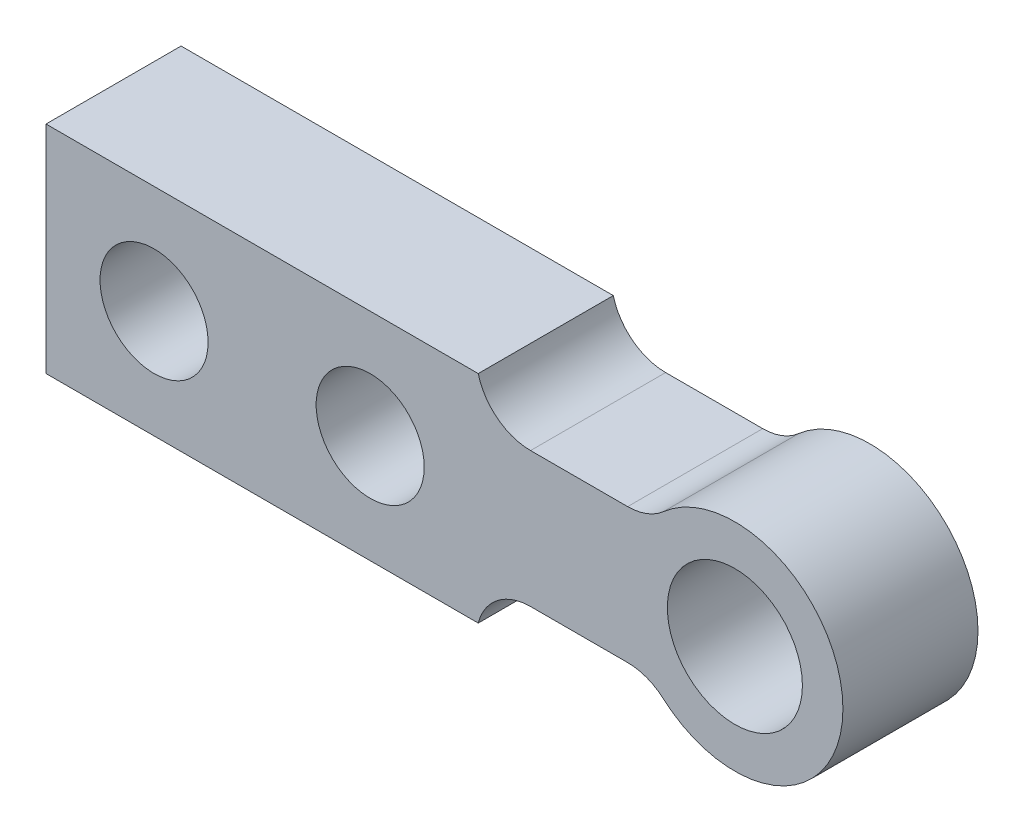
ISO-10303-21;
HEADER;
FILE_DESCRIPTION(('STEP AP214'),'2;1');
FILE_NAME('part.step','',(''),(''),'','','');
FILE_SCHEMA(('AUTOMOTIVE_DESIGN { 1 0 10303 214 1 1 1 1 }'));
ENDSEC;
DATA;
#1=APPLICATION_CONTEXT('core data for automotive mechanical design processes');
#2=APPLICATION_PROTOCOL_DEFINITION('international standard','automotive_design',2000,#1);
#3=PRODUCT_CONTEXT('',#1,'mechanical');
#4=PRODUCT('Part','Part','',(#3));
#5=PRODUCT_RELATED_PRODUCT_CATEGORY('part','',(#4));
#6=PRODUCT_DEFINITION_FORMATION('','',#4);
#7=PRODUCT_DEFINITION_CONTEXT('part definition',#1,'design');
#8=PRODUCT_DEFINITION('design','',#6,#7);
#9=PRODUCT_DEFINITION_SHAPE('','',#8);
#10=(LENGTH_UNIT() NAMED_UNIT(*) SI_UNIT(.MILLI.,.METRE.));
#11=(NAMED_UNIT(*) PLANE_ANGLE_UNIT() SI_UNIT($,.RADIAN.));
#12=(NAMED_UNIT(*) SI_UNIT($,.STERADIAN.) SOLID_ANGLE_UNIT());
#13=UNCERTAINTY_MEASURE_WITH_UNIT(LENGTH_MEASURE(1.E-05),#10,'distance_accuracy_value','');
#14=(GEOMETRIC_REPRESENTATION_CONTEXT(3) GLOBAL_UNCERTAINTY_ASSIGNED_CONTEXT((#13)) GLOBAL_UNIT_ASSIGNED_CONTEXT((#10,
#11,#12)) REPRESENTATION_CONTEXT('',''));
#15=CARTESIAN_POINT('',(0.,0.,0.));
#16=DIRECTION('',(0.,0.,1.));
#17=DIRECTION('',(1.,0.,0.));
#18=AXIS2_PLACEMENT_3D('',#15,#16,#17);
#19=CARTESIAN_POINT('',(0.,-2.5,5.));
#20=DIRECTION('',(0.,1.,0.));
#21=DIRECTION('',(0.,0.,1.));
#22=AXIS2_PLACEMENT_3D('',#19,#20,#21);
#23=PLANE('',#22);
#24=DIRECTION('',(1.,0.,0.));
#25=VECTOR('',#24,1.);
#26=CARTESIAN_POINT('',(0.,-2.5,0.));
#27=LINE('',#26,#25);
#28=CARTESIAN_POINT('',(9.93649167310371,-2.5,0.));
#29=VERTEX_POINT('',#28);
#30=CARTESIAN_POINT('',(13.5313730334031,-2.5,0.));
#31=VERTEX_POINT('',#30);
#32=EDGE_CURVE('E175',#29,#31,#27,.T.);
#33=ORIENTED_EDGE('',*,*,#32,.T.);
#34=DIRECTION('',(0.,0.,1.));
#35=VECTOR('',#34,1.);
#36=CARTESIAN_POINT('',(13.5313730334031,-2.5,5.));
#37=LINE('',#36,#35);
#38=CARTESIAN_POINT('',(13.5313730334031,-2.5,5.));
#39=VERTEX_POINT('',#38);
#40=EDGE_CURVE('E144',#31,#39,#37,.T.);
#41=ORIENTED_EDGE('',*,*,#40,.T.);
#42=DIRECTION('',(1.,0.,0.));
#43=VECTOR('',#42,1.);
#44=CARTESIAN_POINT('',(0.,-2.5,5.));
#45=LINE('',#44,#43);
#46=CARTESIAN_POINT('',(9.93649167310371,-2.5,5.));
#47=VERTEX_POINT('',#46);
#48=EDGE_CURVE('E192',#47,#39,#45,.T.);
#49=ORIENTED_EDGE('',*,*,#48,.F.);
#50=DIRECTION('',(0.,0.,1.));
#51=VECTOR('',#50,1.);
#52=CARTESIAN_POINT('',(9.93649167310371,-2.5,5.));
#53=LINE('',#52,#51);
#54=EDGE_CURVE('E141',#47,#29,#53,.F.);
#55=ORIENTED_EDGE('',*,*,#54,.T.);
#56=EDGE_LOOP('',(#33,#41,#49,#55));
#57=FACE_BOUND('',#56,.T.);
#58=ADVANCED_FACE('F37',(#57),#23,.F.);
#59=CARTESIAN_POINT('',(17.5,0.,5.));
#60=DIRECTION('',(0.,0.,-1.));
#61=DIRECTION('',(-1.,0.,0.));
#62=AXIS2_PLACEMENT_3D('',#59,#60,#61);
#63=CYLINDRICAL_SURFACE('',#62,4.);
#64=CARTESIAN_POINT('',(17.5,0.,5.));
#65=DIRECTION('',(0.,0.,1.));
#66=DIRECTION('',(1.,0.,0.));
#67=AXIS2_PLACEMENT_3D('',#64,#65,#66);
#68=CIRCLE('',#67,4.);
#69=CARTESIAN_POINT('',(14.8542486889354,-3.,5.));
#70=VERTEX_POINT('',#69);
#71=CARTESIAN_POINT('',(14.8542486889354,3.,5.));
#72=VERTEX_POINT('',#71);
#73=EDGE_CURVE('E215',#70,#72,#68,.T.);
#74=ORIENTED_EDGE('',*,*,#73,.F.);
#75=DIRECTION('',(0.,0.,-1.));
#76=VECTOR('',#75,1.);
#77=CARTESIAN_POINT('',(14.8542486889354,-3.,5.));
#78=LINE('',#77,#76);
#79=CARTESIAN_POINT('',(14.8542486889354,-3.,0.));
#80=VERTEX_POINT('',#79);
#81=EDGE_CURVE('E133',#70,#80,#78,.T.);
#82=ORIENTED_EDGE('',*,*,#81,.T.);
#83=CARTESIAN_POINT('',(17.5,0.,0.));
#84=DIRECTION('',(0.,0.,1.));
#85=DIRECTION('',(1.,0.,0.));
#86=AXIS2_PLACEMENT_3D('',#83,#84,#85);
#87=CIRCLE('',#86,4.);
#88=CARTESIAN_POINT('',(14.8542486889354,3.,0.));
#89=VERTEX_POINT('',#88);
#90=EDGE_CURVE('E170',#80,#89,#87,.T.);
#91=ORIENTED_EDGE('',*,*,#90,.T.);
#92=DIRECTION('',(0.,0.,-1.));
#93=VECTOR('',#92,1.);
#94=CARTESIAN_POINT('',(14.8542486889354,3.,5.));
#95=LINE('',#94,#93);
#96=EDGE_CURVE('E131',#89,#72,#95,.F.);
#97=ORIENTED_EDGE('',*,*,#96,.T.);
#98=EDGE_LOOP('',(#74,#82,#91,#97));
#99=FACE_BOUND('',#98,.T.);
#100=ADVANCED_FACE('F245',(#99),#63,.T.);
#101=CARTESIAN_POINT('',(0.,2.5,5.));
#102=DIRECTION('',(0.,1.,0.));
#103=DIRECTION('',(0.,0.,1.));
#104=AXIS2_PLACEMENT_3D('',#101,#102,#103);
#105=PLANE('',#104);
#106=DIRECTION('',(1.,0.,0.));
#107=VECTOR('',#106,1.);
#108=CARTESIAN_POINT('',(0.,2.5,5.));
#109=LINE('',#108,#107);
#110=CARTESIAN_POINT('',(9.93649167310371,2.5,5.));
#111=VERTEX_POINT('',#110);
#112=CARTESIAN_POINT('',(13.5313730334031,2.5,5.));
#113=VERTEX_POINT('',#112);
#114=EDGE_CURVE('E118',#111,#113,#109,.T.);
#115=ORIENTED_EDGE('',*,*,#114,.T.);
#116=DIRECTION('',(0.,0.,-1.));
#117=VECTOR('',#116,1.);
#118=CARTESIAN_POINT('',(13.5313730334031,2.5,5.));
#119=LINE('',#118,#117);
#120=CARTESIAN_POINT('',(13.5313730334031,2.5,0.));
#121=VERTEX_POINT('',#120);
#122=EDGE_CURVE('E147',#113,#121,#119,.T.);
#123=ORIENTED_EDGE('',*,*,#122,.T.);
#124=DIRECTION('',(1.,0.,0.));
#125=VECTOR('',#124,1.);
#126=CARTESIAN_POINT('',(0.,2.5,0.));
#127=LINE('',#126,#125);
#128=CARTESIAN_POINT('',(9.93649167310371,2.5,0.));
#129=VERTEX_POINT('',#128);
#130=EDGE_CURVE('E165',#129,#121,#127,.T.);
#131=ORIENTED_EDGE('',*,*,#130,.F.);
#132=DIRECTION('',(0.,0.,-1.));
#133=VECTOR('',#132,1.);
#134=CARTESIAN_POINT('',(9.93649167310371,2.5,5.));
#135=LINE('',#134,#133);
#136=EDGE_CURVE('E59',#129,#111,#135,.F.);
#137=ORIENTED_EDGE('',*,*,#136,.T.);
#138=EDGE_LOOP('',(#115,#123,#131,#137));
#139=FACE_BOUND('',#138,.T.);
#140=ADVANCED_FACE('F168',(#139),#105,.T.);
#141=CARTESIAN_POINT('',(0.,4.,5.));
#142=DIRECTION('',(0.,1.,0.));
#143=DIRECTION('',(0.,0.,1.));
#144=AXIS2_PLACEMENT_3D('',#141,#142,#143);
#145=PLANE('',#144);
#146=DIRECTION('',(1.,0.,0.));
#147=VECTOR('',#146,1.);
#148=CARTESIAN_POINT('',(0.,4.,0.));
#149=LINE('',#148,#147);
#150=CARTESIAN_POINT('',(-8.,4.,0.));
#151=VERTEX_POINT('',#150);
#152=CARTESIAN_POINT('',(8.,4.,0.));
#153=VERTEX_POINT('',#152);
#154=EDGE_CURVE('E167',#151,#153,#149,.T.);
#155=ORIENTED_EDGE('',*,*,#154,.F.);
#156=DIRECTION('',(0.,0.,-1.));
#157=VECTOR('',#156,1.);
#158=CARTESIAN_POINT('',(-8.,4.,5.));
#159=LINE('',#158,#157);
#160=CARTESIAN_POINT('',(-8.,4.,5.));
#161=VERTEX_POINT('',#160);
#162=EDGE_CURVE('E127',#161,#151,#159,.T.);
#163=ORIENTED_EDGE('',*,*,#162,.F.);
#164=DIRECTION('',(1.,0.,0.));
#165=VECTOR('',#164,1.);
#166=CARTESIAN_POINT('',(0.,4.,5.));
#167=LINE('',#166,#165);
#168=CARTESIAN_POINT('',(8.,4.,5.));
#169=VERTEX_POINT('',#168);
#170=EDGE_CURVE('E117',#161,#169,#167,.T.);
#171=ORIENTED_EDGE('',*,*,#170,.T.);
#172=DIRECTION('',(0.,0.,-1.));
#173=VECTOR('',#172,1.);
#174=CARTESIAN_POINT('',(8.,4.,5.));
#175=LINE('',#174,#173);
#176=EDGE_CURVE('E125',#169,#153,#175,.T.);
#177=ORIENTED_EDGE('',*,*,#176,.T.);
#178=EDGE_LOOP('',(#155,#163,#171,#177));
#179=FACE_BOUND('',#178,.T.);
#180=ADVANCED_FACE('F124',(#179),#145,.T.);
#181=CARTESIAN_POINT('',(-8.,0.,5.));
#182=DIRECTION('',(1.,0.,0.));
#183=DIRECTION('',(0.,1.,0.));
#184=AXIS2_PLACEMENT_3D('',#181,#182,#183);
#185=PLANE('',#184);
#186=DIRECTION('',(0.,-1.,0.));
#187=VECTOR('',#186,1.);
#188=CARTESIAN_POINT('',(-8.,0.,0.));
#189=LINE('',#188,#187);
#190=CARTESIAN_POINT('',(-8.,-4.,0.));
#191=VERTEX_POINT('',#190);
#192=EDGE_CURVE('E172',#151,#191,#189,.T.);
#193=ORIENTED_EDGE('',*,*,#192,.T.);
#194=DIRECTION('',(0.,0.,-1.));
#195=VECTOR('',#194,1.);
#196=CARTESIAN_POINT('',(-8.,-4.,5.));
#197=LINE('',#196,#195);
#198=CARTESIAN_POINT('',(-8.,-4.,5.));
#199=VERTEX_POINT('',#198);
#200=EDGE_CURVE('E135',#199,#191,#197,.T.);
#201=ORIENTED_EDGE('',*,*,#200,.F.);
#202=DIRECTION('',(0.,-1.,0.));
#203=VECTOR('',#202,1.);
#204=CARTESIAN_POINT('',(-8.,0.,5.));
#205=LINE('',#204,#203);
#206=EDGE_CURVE('E129',#161,#199,#205,.T.);
#207=ORIENTED_EDGE('',*,*,#206,.F.);
#208=ORIENTED_EDGE('',*,*,#162,.T.);
#209=EDGE_LOOP('',(#193,#201,#207,#208));
#210=FACE_BOUND('',#209,.T.);
#211=ADVANCED_FACE('F309',(#210),#185,.F.);
#212=CARTESIAN_POINT('',(0.,-4.,5.));
#213=DIRECTION('',(0.,1.,0.));
#214=DIRECTION('',(0.,0.,1.));
#215=AXIS2_PLACEMENT_3D('',#212,#213,#214);
#216=PLANE('',#215);
#217=DIRECTION('',(1.,0.,0.));
#218=VECTOR('',#217,1.);
#219=CARTESIAN_POINT('',(0.,-4.,0.));
#220=LINE('',#219,#218);
#221=CARTESIAN_POINT('',(8.,-4.,0.));
#222=VERTEX_POINT('',#221);
#223=EDGE_CURVE('E180',#191,#222,#220,.T.);
#224=ORIENTED_EDGE('',*,*,#223,.T.);
#225=DIRECTION('',(0.,0.,-1.));
#226=VECTOR('',#225,1.);
#227=CARTESIAN_POINT('',(8.,-4.,5.));
#228=LINE('',#227,#226);
#229=CARTESIAN_POINT('',(8.,-4.,5.));
#230=VERTEX_POINT('',#229);
#231=EDGE_CURVE('E193',#230,#222,#228,.T.);
#232=ORIENTED_EDGE('',*,*,#231,.F.);
#233=DIRECTION('',(1.,0.,0.));
#234=VECTOR('',#233,1.);
#235=CARTESIAN_POINT('',(0.,-4.,5.));
#236=LINE('',#235,#234);
#237=EDGE_CURVE('E203',#199,#230,#236,.T.);
#238=ORIENTED_EDGE('',*,*,#237,.F.);
#239=ORIENTED_EDGE('',*,*,#200,.T.);
#240=EDGE_LOOP('',(#224,#232,#238,#239));
#241=FACE_BOUND('',#240,.T.);
#242=ADVANCED_FACE('F201',(#241),#216,.F.);
#243=CARTESIAN_POINT('',(-4.,0.,5.));
#244=DIRECTION('',(0.,0.,-1.));
#245=DIRECTION('',(-1.,0.,0.));
#246=AXIS2_PLACEMENT_3D('',#243,#244,#245);
#247=CYLINDRICAL_SURFACE('',#246,2.);
#248=CARTESIAN_POINT('',(-4.,0.,5.));
#249=DIRECTION('',(0.,0.,1.));
#250=DIRECTION('',(1.,0.,0.));
#251=AXIS2_PLACEMENT_3D('',#248,#249,#250);
#252=CIRCLE('',#251,2.);
#253=CARTESIAN_POINT('',(-2.,0.,5.));
#254=VERTEX_POINT('',#253);
#255=EDGE_CURVE('E225',#254,#254,#252,.T.);
#256=ORIENTED_EDGE('',*,*,#255,.T.);
#257=EDGE_LOOP('',(#256));
#258=FACE_BOUND('',#257,.T.);
#259=CARTESIAN_POINT('',(-4.,0.,0.));
#260=DIRECTION('',(0.,0.,1.));
#261=DIRECTION('',(1.,0.,0.));
#262=AXIS2_PLACEMENT_3D('',#259,#260,#261);
#263=CIRCLE('',#262,2.);
#264=CARTESIAN_POINT('',(-2.,0.,0.));
#265=VERTEX_POINT('',#264);
#266=EDGE_CURVE('E186',#265,#265,#263,.T.);
#267=ORIENTED_EDGE('',*,*,#266,.F.);
#268=EDGE_LOOP('',(#267));
#269=FACE_BOUND('',#268,.T.);
#270=ADVANCED_FACE('F308',(#258,#269),#247,.F.);
#271=CARTESIAN_POINT('',(4.,0.,5.));
#272=DIRECTION('',(0.,0.,-1.));
#273=DIRECTION('',(-1.,0.,0.));
#274=AXIS2_PLACEMENT_3D('',#271,#272,#273);
#275=CYLINDRICAL_SURFACE('',#274,2.);
#276=CARTESIAN_POINT('',(4.,0.,5.));
#277=DIRECTION('',(0.,0.,1.));
#278=DIRECTION('',(1.,0.,0.));
#279=AXIS2_PLACEMENT_3D('',#276,#277,#278);
#280=CIRCLE('',#279,2.);
#281=CARTESIAN_POINT('',(6.,0.,5.));
#282=VERTEX_POINT('',#281);
#283=EDGE_CURVE('E222',#282,#282,#280,.T.);
#284=ORIENTED_EDGE('',*,*,#283,.T.);
#285=EDGE_LOOP('',(#284));
#286=FACE_BOUND('',#285,.T.);
#287=CARTESIAN_POINT('',(4.,0.,0.));
#288=DIRECTION('',(0.,0.,1.));
#289=DIRECTION('',(1.,0.,0.));
#290=AXIS2_PLACEMENT_3D('',#287,#288,#289);
#291=CIRCLE('',#290,2.);
#292=CARTESIAN_POINT('',(6.,0.,0.));
#293=VERTEX_POINT('',#292);
#294=EDGE_CURVE('E183',#293,#293,#291,.T.);
#295=ORIENTED_EDGE('',*,*,#294,.F.);
#296=EDGE_LOOP('',(#295));
#297=FACE_BOUND('',#296,.T.);
#298=ADVANCED_FACE('F242',(#286,#297),#275,.F.);
#299=CARTESIAN_POINT('',(17.5,0.,5.));
#300=DIRECTION('',(0.,0.,-1.));
#301=DIRECTION('',(-1.,0.,0.));
#302=AXIS2_PLACEMENT_3D('',#299,#300,#301);
#303=CYLINDRICAL_SURFACE('',#302,2.5);
#304=CARTESIAN_POINT('',(17.5,0.,5.));
#305=DIRECTION('',(0.,0.,1.));
#306=DIRECTION('',(1.,0.,0.));
#307=AXIS2_PLACEMENT_3D('',#304,#305,#306);
#308=CIRCLE('',#307,2.5);
#309=CARTESIAN_POINT('',(20.,0.,5.));
#310=VERTEX_POINT('',#309);
#311=EDGE_CURVE('E195',#310,#310,#308,.T.);
#312=ORIENTED_EDGE('',*,*,#311,.T.);
#313=EDGE_LOOP('',(#312));
#314=FACE_BOUND('',#313,.T.);
#315=CARTESIAN_POINT('',(17.5,0.,0.));
#316=DIRECTION('',(0.,0.,1.));
#317=DIRECTION('',(1.,0.,0.));
#318=AXIS2_PLACEMENT_3D('',#315,#316,#317);
#319=CIRCLE('',#318,2.5);
#320=CARTESIAN_POINT('',(20.,0.,0.));
#321=VERTEX_POINT('',#320);
#322=EDGE_CURVE('E189',#321,#321,#319,.T.);
#323=ORIENTED_EDGE('',*,*,#322,.F.);
#324=EDGE_LOOP('',(#323));
#325=FACE_BOUND('',#324,.T.);
#326=ADVANCED_FACE('F231',(#314,#325),#303,.F.);
#327=CARTESIAN_POINT('',(0.,0.,5.));
#328=DIRECTION('',(0.,0.,1.));
#329=DIRECTION('',(1.,0.,0.));
#330=AXIS2_PLACEMENT_3D('',#327,#328,#329);
#331=PLANE('',#330);
#332=ORIENTED_EDGE('',*,*,#237,.T.);
#333=CARTESIAN_POINT('',(9.93649167310371,-4.5,5.));
#334=DIRECTION('',(0.,0.,1.));
#335=DIRECTION('',(1.,0.,0.));
#336=AXIS2_PLACEMENT_3D('',#333,#334,#335);
#337=CIRCLE('',#336,2.);
#338=EDGE_CURVE('E156',#230,#47,#337,.F.);
#339=ORIENTED_EDGE('',*,*,#338,.T.);
#340=ORIENTED_EDGE('',*,*,#48,.T.);
#341=CARTESIAN_POINT('',(13.5313730334031,-4.5,5.));
#342=DIRECTION('',(0.,0.,1.));
#343=DIRECTION('',(1.,0.,0.));
#344=AXIS2_PLACEMENT_3D('',#341,#342,#343);
#345=CIRCLE('',#344,2.);
#346=EDGE_CURVE('E152',#39,#70,#345,.F.);
#347=ORIENTED_EDGE('',*,*,#346,.T.);
#348=ORIENTED_EDGE('',*,*,#73,.T.);
#349=CARTESIAN_POINT('',(13.5313730334031,4.5,5.));
#350=DIRECTION('',(0.,0.,1.));
#351=DIRECTION('',(1.,0.,0.));
#352=AXIS2_PLACEMENT_3D('',#349,#350,#351);
#353=CIRCLE('',#352,2.);
#354=EDGE_CURVE('E52',#72,#113,#353,.F.);
#355=ORIENTED_EDGE('',*,*,#354,.T.);
#356=ORIENTED_EDGE('',*,*,#114,.F.);
#357=CARTESIAN_POINT('',(9.93649167310371,4.5,5.));
#358=DIRECTION('',(0.,0.,1.));
#359=DIRECTION('',(1.,0.,0.));
#360=AXIS2_PLACEMENT_3D('',#357,#358,#359);
#361=CIRCLE('',#360,2.);
#362=EDGE_CURVE('E11',#111,#169,#361,.F.);
#363=ORIENTED_EDGE('',*,*,#362,.T.);
#364=ORIENTED_EDGE('',*,*,#170,.F.);
#365=ORIENTED_EDGE('',*,*,#206,.T.);
#366=EDGE_LOOP('',(#332,#339,#340,#347,#348,#355,#356,#363,#364,#365));
#367=FACE_BOUND('',#366,.T.);
#368=ORIENTED_EDGE('',*,*,#283,.F.);
#369=EDGE_LOOP('',(#368));
#370=FACE_BOUND('',#369,.T.);
#371=ORIENTED_EDGE('',*,*,#255,.F.);
#372=EDGE_LOOP('',(#371));
#373=FACE_BOUND('',#372,.T.);
#374=ORIENTED_EDGE('',*,*,#311,.F.);
#375=EDGE_LOOP('',(#374));
#376=FACE_BOUND('',#375,.T.);
#377=ADVANCED_FACE('F115',(#367,#370,#373,#376),#331,.T.);
#378=CARTESIAN_POINT('',(0.,0.,0.));
#379=DIRECTION('',(0.,0.,1.));
#380=DIRECTION('',(1.,0.,0.));
#381=AXIS2_PLACEMENT_3D('',#378,#379,#380);
#382=PLANE('',#381);
#383=ORIENTED_EDGE('',*,*,#32,.F.);
#384=CARTESIAN_POINT('',(9.93649167310371,-4.5,0.));
#385=DIRECTION('',(0.,0.,1.));
#386=DIRECTION('',(1.,0.,0.));
#387=AXIS2_PLACEMENT_3D('',#384,#385,#386);
#388=CIRCLE('',#387,2.);
#389=EDGE_CURVE('E154',#29,#222,#388,.T.);
#390=ORIENTED_EDGE('',*,*,#389,.T.);
#391=ORIENTED_EDGE('',*,*,#223,.F.);
#392=ORIENTED_EDGE('',*,*,#192,.F.);
#393=ORIENTED_EDGE('',*,*,#154,.T.);
#394=CARTESIAN_POINT('',(9.93649167310371,4.5,0.));
#395=DIRECTION('',(0.,0.,1.));
#396=DIRECTION('',(1.,0.,0.));
#397=AXIS2_PLACEMENT_3D('',#394,#395,#396);
#398=CIRCLE('',#397,2.);
#399=EDGE_CURVE('E45',#153,#129,#398,.T.);
#400=ORIENTED_EDGE('',*,*,#399,.T.);
#401=ORIENTED_EDGE('',*,*,#130,.T.);
#402=CARTESIAN_POINT('',(13.5313730334031,4.5,0.));
#403=DIRECTION('',(0.,0.,1.));
#404=DIRECTION('',(1.,0.,0.));
#405=AXIS2_PLACEMENT_3D('',#402,#403,#404);
#406=CIRCLE('',#405,2.);
#407=EDGE_CURVE('E158',#121,#89,#406,.T.);
#408=ORIENTED_EDGE('',*,*,#407,.T.);
#409=ORIENTED_EDGE('',*,*,#90,.F.);
#410=CARTESIAN_POINT('',(13.5313730334031,-4.5,0.));
#411=DIRECTION('',(0.,0.,1.));
#412=DIRECTION('',(1.,0.,0.));
#413=AXIS2_PLACEMENT_3D('',#410,#411,#412);
#414=CIRCLE('',#413,2.);
#415=EDGE_CURVE('E150',#80,#31,#414,.T.);
#416=ORIENTED_EDGE('',*,*,#415,.T.);
#417=EDGE_LOOP('',(#383,#390,#391,#392,#393,#400,#401,#408,#409,#416));
#418=FACE_BOUND('',#417,.T.);
#419=ORIENTED_EDGE('',*,*,#294,.T.);
#420=EDGE_LOOP('',(#419));
#421=FACE_BOUND('',#420,.T.);
#422=ORIENTED_EDGE('',*,*,#266,.T.);
#423=EDGE_LOOP('',(#422));
#424=FACE_BOUND('',#423,.T.);
#425=ORIENTED_EDGE('',*,*,#322,.T.);
#426=EDGE_LOOP('',(#425));
#427=FACE_BOUND('',#426,.T.);
#428=ADVANCED_FACE('F163',(#418,#421,#424,#427),#382,.F.);
#429=CARTESIAN_POINT('',(13.5313730334031,-4.5,5.));
#430=DIRECTION('',(0.,0.,-1.));
#431=DIRECTION('',(-1.,0.,0.));
#432=AXIS2_PLACEMENT_3D('',#429,#430,#431);
#433=CYLINDRICAL_SURFACE('',#432,2.);
#434=ORIENTED_EDGE('',*,*,#346,.F.);
#435=ORIENTED_EDGE('',*,*,#40,.F.);
#436=ORIENTED_EDGE('',*,*,#415,.F.);
#437=ORIENTED_EDGE('',*,*,#81,.F.);
#438=EDGE_LOOP('',(#434,#435,#436,#437));
#439=FACE_BOUND('',#438,.T.);
#440=ADVANCED_FACE('F240',(#439),#433,.F.);
#441=CARTESIAN_POINT('',(9.93649167310371,-4.5,5.));
#442=DIRECTION('',(0.,0.,1.));
#443=DIRECTION('',(1.,0.,0.));
#444=AXIS2_PLACEMENT_3D('',#441,#442,#443);
#445=CYLINDRICAL_SURFACE('',#444,2.);
#446=ORIENTED_EDGE('',*,*,#338,.F.);
#447=ORIENTED_EDGE('',*,*,#231,.T.);
#448=ORIENTED_EDGE('',*,*,#389,.F.);
#449=ORIENTED_EDGE('',*,*,#54,.F.);
#450=EDGE_LOOP('',(#446,#447,#448,#449));
#451=FACE_BOUND('',#450,.T.);
#452=ADVANCED_FACE('F209',(#451),#445,.F.);
#453=CARTESIAN_POINT('',(13.5313730334031,4.5,5.));
#454=DIRECTION('',(0.,0.,-1.));
#455=DIRECTION('',(-1.,0.,0.));
#456=AXIS2_PLACEMENT_3D('',#453,#454,#455);
#457=CYLINDRICAL_SURFACE('',#456,2.);
#458=ORIENTED_EDGE('',*,*,#354,.F.);
#459=ORIENTED_EDGE('',*,*,#96,.F.);
#460=ORIENTED_EDGE('',*,*,#407,.F.);
#461=ORIENTED_EDGE('',*,*,#122,.F.);
#462=EDGE_LOOP('',(#458,#459,#460,#461));
#463=FACE_BOUND('',#462,.T.);
#464=ADVANCED_FACE('F258',(#463),#457,.F.);
#465=CARTESIAN_POINT('',(9.93649167310371,4.5,5.));
#466=DIRECTION('',(0.,0.,1.));
#467=DIRECTION('',(1.,0.,0.));
#468=AXIS2_PLACEMENT_3D('',#465,#466,#467);
#469=CYLINDRICAL_SURFACE('',#468,2.);
#470=ORIENTED_EDGE('',*,*,#362,.F.);
#471=ORIENTED_EDGE('',*,*,#136,.F.);
#472=ORIENTED_EDGE('',*,*,#399,.F.);
#473=ORIENTED_EDGE('',*,*,#176,.F.);
#474=EDGE_LOOP('',(#470,#471,#472,#473));
#475=FACE_BOUND('',#474,.T.);
#476=ADVANCED_FACE('F39',(#475),#469,.F.);
#477=CLOSED_SHELL('',(#58,#100,#140,#180,#211,#242,#270,#298,#326,#377,#428,#440,#452,#464,#476));
#478=MANIFOLD_SOLID_BREP('B2',#477);
#479=ADVANCED_BREP_SHAPE_REPRESENTATION('',(#18,#478),#14);
#480=SHAPE_DEFINITION_REPRESENTATION(#9,#479);
ENDSEC;
END-ISO-10303-21;
